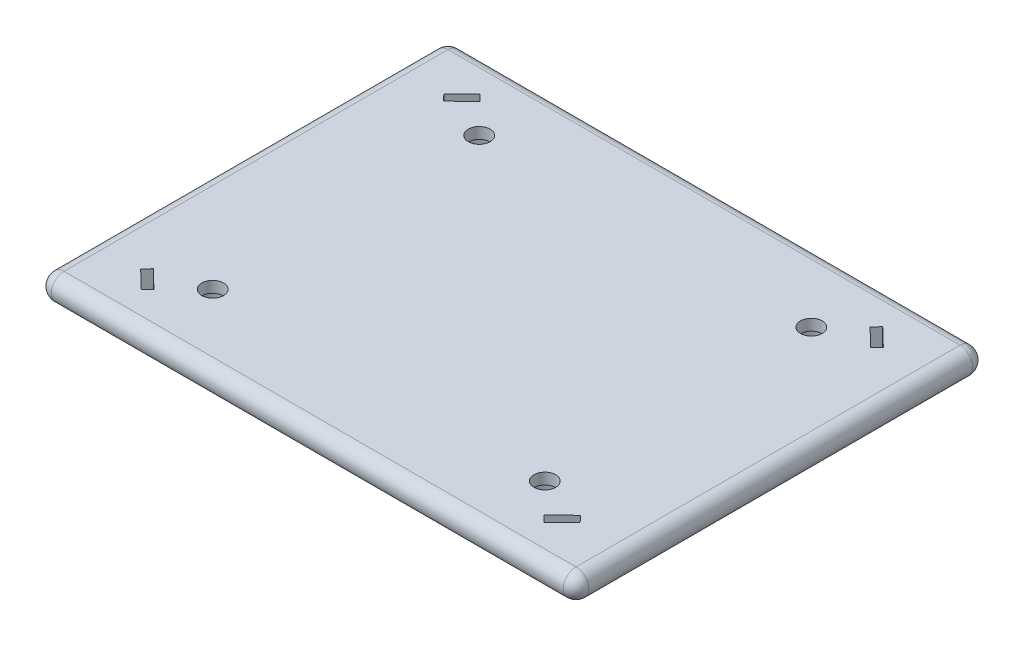
ISO-10303-21;
HEADER;
FILE_DESCRIPTION(('STEP AP214'),'2;1');
FILE_NAME('part.step','',(''),(''),'','','');
FILE_SCHEMA(('AUTOMOTIVE_DESIGN { 1 0 10303 214 1 1 1 1 }'));
ENDSEC;
DATA;
#1=APPLICATION_CONTEXT('core data for automotive mechanical design processes');
#2=APPLICATION_PROTOCOL_DEFINITION('international standard','automotive_design',2000,#1);
#3=PRODUCT_CONTEXT('',#1,'mechanical');
#4=PRODUCT('Part','Part','',(#3));
#5=PRODUCT_RELATED_PRODUCT_CATEGORY('part','',(#4));
#6=PRODUCT_DEFINITION_FORMATION('','',#4);
#7=PRODUCT_DEFINITION_CONTEXT('part definition',#1,'design');
#8=PRODUCT_DEFINITION('design','',#6,#7);
#9=PRODUCT_DEFINITION_SHAPE('','',#8);
#10=(LENGTH_UNIT() NAMED_UNIT(*) SI_UNIT(.MILLI.,.METRE.));
#11=(NAMED_UNIT(*) PLANE_ANGLE_UNIT() SI_UNIT($,.RADIAN.));
#12=(NAMED_UNIT(*) SI_UNIT($,.STERADIAN.) SOLID_ANGLE_UNIT());
#13=UNCERTAINTY_MEASURE_WITH_UNIT(LENGTH_MEASURE(1.E-05),#10,'distance_accuracy_value','');
#14=(GEOMETRIC_REPRESENTATION_CONTEXT(3) GLOBAL_UNCERTAINTY_ASSIGNED_CONTEXT((#13)) GLOBAL_UNIT_ASSIGNED_CONTEXT((#10,
#11,#12)) REPRESENTATION_CONTEXT('',''));
#15=CARTESIAN_POINT('',(0.,0.,0.));
#16=DIRECTION('',(0.,0.,1.));
#17=DIRECTION('',(1.,0.,0.));
#18=AXIS2_PLACEMENT_3D('',#15,#16,#17);
#19=CARTESIAN_POINT('',(200.,10.,150.));
#20=DIRECTION('',(0.,0.,1.));
#21=DIRECTION('',(1.,0.,0.));
#22=AXIS2_PLACEMENT_3D('',#19,#20,#21);
#23=SPHERICAL_SURFACE('',#22,10.);
#24=CARTESIAN_POINT('',(200.,10.,150.));
#25=DIRECTION('',(0.,0.,-1.));
#26=DIRECTION('',(0.,1.,0.));
#27=AXIS2_PLACEMENT_3D('',#24,#25,#26);
#28=CIRCLE('',#27,10.);
#29=CARTESIAN_POINT('',(200.,20.,150.));
#30=VERTEX_POINT('',#29);
#31=CARTESIAN_POINT('',(200.,0.,150.));
#32=VERTEX_POINT('',#31);
#33=EDGE_CURVE('E11',#30,#32,#28,.T.);
#34=ORIENTED_EDGE('',*,*,#33,.F.);
#35=CARTESIAN_POINT('',(200.,10.,150.));
#36=DIRECTION('',(1.,0.,0.));
#37=DIRECTION('',(0.,0.,-1.));
#38=AXIS2_PLACEMENT_3D('',#35,#36,#37);
#39=CIRCLE('',#38,10.);
#40=EDGE_CURVE('E47',#30,#32,#39,.T.);
#41=ORIENTED_EDGE('',*,*,#40,.T.);
#42=EDGE_LOOP('',(#34,#41));
#43=FACE_BOUND('',#42,.T.);
#44=ADVANCED_FACE('F39',(#43),#23,.T.);
#45=CARTESIAN_POINT('',(-200.,10.,150.));
#46=DIRECTION('',(1.,0.,0.));
#47=DIRECTION('',(0.,0.,-1.));
#48=AXIS2_PLACEMENT_3D('',#45,#46,#47);
#49=CYLINDRICAL_SURFACE('',#48,10.);
#50=ORIENTED_EDGE('',*,*,#40,.F.);
#51=DIRECTION('',(1.,0.,0.));
#52=VECTOR('',#51,1.);
#53=CARTESIAN_POINT('',(200.,20.,150.));
#54=LINE('',#53,#52);
#55=CARTESIAN_POINT('',(-200.,20.,150.));
#56=VERTEX_POINT('',#55);
#57=EDGE_CURVE('E314',#56,#30,#54,.T.);
#58=ORIENTED_EDGE('',*,*,#57,.F.);
#59=CARTESIAN_POINT('',(-200.,10.,150.));
#60=DIRECTION('',(1.,0.,0.));
#61=DIRECTION('',(0.,0.,-1.));
#62=AXIS2_PLACEMENT_3D('',#59,#60,#61);
#63=CIRCLE('',#62,10.);
#64=CARTESIAN_POINT('',(-200.,0.,150.));
#65=VERTEX_POINT('',#64);
#66=EDGE_CURVE('E347',#56,#65,#63,.T.);
#67=ORIENTED_EDGE('',*,*,#66,.T.);
#68=DIRECTION('',(-1.,0.,0.));
#69=VECTOR('',#68,1.);
#70=CARTESIAN_POINT('',(-200.,0.,150.));
#71=LINE('',#70,#69);
#72=EDGE_CURVE('E326',#32,#65,#71,.T.);
#73=ORIENTED_EDGE('',*,*,#72,.F.);
#74=EDGE_LOOP('',(#50,#58,#67,#73));
#75=FACE_BOUND('',#74,.T.);
#76=ADVANCED_FACE('F361',(#75),#49,.T.);
#77=CARTESIAN_POINT('',(-200.,10.,150.));
#78=DIRECTION('',(0.,0.,1.));
#79=DIRECTION('',(1.,0.,0.));
#80=AXIS2_PLACEMENT_3D('',#77,#78,#79);
#81=SPHERICAL_SURFACE('',#80,10.);
#82=ORIENTED_EDGE('',*,*,#66,.F.);
#83=CARTESIAN_POINT('',(-200.,10.,150.));
#84=DIRECTION('',(0.,0.,1.));
#85=DIRECTION('',(0.,-1.,0.));
#86=AXIS2_PLACEMENT_3D('',#83,#84,#85);
#87=CIRCLE('',#86,10.);
#88=EDGE_CURVE('E344',#56,#65,#87,.T.);
#89=ORIENTED_EDGE('',*,*,#88,.T.);
#90=EDGE_LOOP('',(#82,#89));
#91=FACE_BOUND('',#90,.T.);
#92=ADVANCED_FACE('F364',(#91),#81,.T.);
#93=CARTESIAN_POINT('',(-200.,10.,-150.));
#94=DIRECTION('',(0.,0.,1.));
#95=DIRECTION('',(1.,0.,0.));
#96=AXIS2_PLACEMENT_3D('',#93,#94,#95);
#97=CYLINDRICAL_SURFACE('',#96,10.);
#98=ORIENTED_EDGE('',*,*,#88,.F.);
#99=DIRECTION('',(0.,0.,1.));
#100=VECTOR('',#99,1.);
#101=CARTESIAN_POINT('',(-200.,20.,150.));
#102=LINE('',#101,#100);
#103=CARTESIAN_POINT('',(-200.,20.,-150.));
#104=VERTEX_POINT('',#103);
#105=EDGE_CURVE('E317',#104,#56,#102,.T.);
#106=ORIENTED_EDGE('',*,*,#105,.F.);
#107=CARTESIAN_POINT('',(-200.,10.,-150.));
#108=DIRECTION('',(0.,0.,1.));
#109=DIRECTION('',(1.,0.,0.));
#110=AXIS2_PLACEMENT_3D('',#107,#108,#109);
#111=CIRCLE('',#110,10.);
#112=CARTESIAN_POINT('',(-200.,0.,-150.));
#113=VERTEX_POINT('',#112);
#114=EDGE_CURVE('E62',#104,#113,#111,.T.);
#115=ORIENTED_EDGE('',*,*,#114,.T.);
#116=DIRECTION('',(0.,0.,-1.));
#117=VECTOR('',#116,1.);
#118=CARTESIAN_POINT('',(-200.,0.,-150.));
#119=LINE('',#118,#117);
#120=EDGE_CURVE('E329',#65,#113,#119,.T.);
#121=ORIENTED_EDGE('',*,*,#120,.F.);
#122=EDGE_LOOP('',(#98,#106,#115,#121));
#123=FACE_BOUND('',#122,.T.);
#124=ADVANCED_FACE('F365',(#123),#97,.T.);
#125=CARTESIAN_POINT('',(-200.,10.,-150.));
#126=DIRECTION('',(0.,0.,1.));
#127=DIRECTION('',(1.,0.,0.));
#128=AXIS2_PLACEMENT_3D('',#125,#126,#127);
#129=SPHERICAL_SURFACE('',#128,10.);
#130=ORIENTED_EDGE('',*,*,#114,.F.);
#131=CARTESIAN_POINT('',(-200.,10.,-150.));
#132=DIRECTION('',(-1.,0.,0.));
#133=DIRECTION('',(0.,-1.,0.));
#134=AXIS2_PLACEMENT_3D('',#131,#132,#133);
#135=CIRCLE('',#134,10.);
#136=EDGE_CURVE('E341',#104,#113,#135,.T.);
#137=ORIENTED_EDGE('',*,*,#136,.T.);
#138=EDGE_LOOP('',(#130,#137));
#139=FACE_BOUND('',#138,.T.);
#140=ADVANCED_FACE('F367',(#139),#129,.T.);
#141=CARTESIAN_POINT('',(200.,10.,-150.));
#142=DIRECTION('',(-1.,0.,0.));
#143=DIRECTION('',(0.,0.,1.));
#144=AXIS2_PLACEMENT_3D('',#141,#142,#143);
#145=CYLINDRICAL_SURFACE('',#144,10.);
#146=ORIENTED_EDGE('',*,*,#136,.F.);
#147=DIRECTION('',(-1.,0.,0.));
#148=VECTOR('',#147,1.);
#149=CARTESIAN_POINT('',(200.,20.,-150.));
#150=LINE('',#149,#148);
#151=CARTESIAN_POINT('',(200.,20.,-150.));
#152=VERTEX_POINT('',#151);
#153=EDGE_CURVE('E320',#152,#104,#150,.T.);
#154=ORIENTED_EDGE('',*,*,#153,.F.);
#155=CARTESIAN_POINT('',(200.,10.,-150.));
#156=DIRECTION('',(-1.,0.,0.));
#157=DIRECTION('',(0.,-1.,0.));
#158=AXIS2_PLACEMENT_3D('',#155,#156,#157);
#159=CIRCLE('',#158,10.);
#160=CARTESIAN_POINT('',(200.,0.,-150.));
#161=VERTEX_POINT('',#160);
#162=EDGE_CURVE('E54',#152,#161,#159,.T.);
#163=ORIENTED_EDGE('',*,*,#162,.T.);
#164=DIRECTION('',(1.,0.,0.));
#165=VECTOR('',#164,1.);
#166=CARTESIAN_POINT('',(200.,0.,-150.));
#167=LINE('',#166,#165);
#168=EDGE_CURVE('E332',#113,#161,#167,.T.);
#169=ORIENTED_EDGE('',*,*,#168,.F.);
#170=EDGE_LOOP('',(#146,#154,#163,#169));
#171=FACE_BOUND('',#170,.T.);
#172=ADVANCED_FACE('F373',(#171),#145,.T.);
#173=CARTESIAN_POINT('',(200.,10.,-150.));
#174=DIRECTION('',(0.,0.,1.));
#175=DIRECTION('',(1.,0.,0.));
#176=AXIS2_PLACEMENT_3D('',#173,#174,#175);
#177=SPHERICAL_SURFACE('',#176,10.);
#178=ORIENTED_EDGE('',*,*,#162,.F.);
#179=CARTESIAN_POINT('',(200.,10.,-150.));
#180=DIRECTION('',(0.,0.,-1.));
#181=DIRECTION('',(0.,1.,0.));
#182=AXIS2_PLACEMENT_3D('',#179,#180,#181);
#183=CIRCLE('',#182,10.);
#184=EDGE_CURVE('E338',#152,#161,#183,.T.);
#185=ORIENTED_EDGE('',*,*,#184,.T.);
#186=EDGE_LOOP('',(#178,#185));
#187=FACE_BOUND('',#186,.T.);
#188=ADVANCED_FACE('F402',(#187),#177,.T.);
#189=CARTESIAN_POINT('',(200.,10.,150.));
#190=DIRECTION('',(0.,0.,-1.));
#191=DIRECTION('',(-1.,0.,0.));
#192=AXIS2_PLACEMENT_3D('',#189,#190,#191);
#193=CYLINDRICAL_SURFACE('',#192,10.);
#194=DIRECTION('',(0.,0.,-1.));
#195=VECTOR('',#194,1.);
#196=CARTESIAN_POINT('',(200.,20.,150.));
#197=LINE('',#196,#195);
#198=EDGE_CURVE('E323',#30,#152,#197,.T.);
#199=ORIENTED_EDGE('',*,*,#198,.F.);
#200=ORIENTED_EDGE('',*,*,#33,.T.);
#201=DIRECTION('',(0.,0.,1.));
#202=VECTOR('',#201,1.);
#203=CARTESIAN_POINT('',(200.,0.,150.));
#204=LINE('',#203,#202);
#205=EDGE_CURVE('E335',#161,#32,#204,.T.);
#206=ORIENTED_EDGE('',*,*,#205,.F.);
#207=ORIENTED_EDGE('',*,*,#184,.F.);
#208=EDGE_LOOP('',(#199,#200,#206,#207));
#209=FACE_BOUND('',#208,.T.);
#210=ADVANCED_FACE('F406',(#209),#193,.T.);
#211=CARTESIAN_POINT('',(200.,20.,150.));
#212=DIRECTION('',(0.,-1.,0.));
#213=DIRECTION('',(0.,0.,-1.));
#214=AXIS2_PLACEMENT_3D('',#211,#212,#213);
#215=PLANE('',#214);
#216=ORIENTED_EDGE('',*,*,#57,.T.);
#217=ORIENTED_EDGE('',*,*,#198,.T.);
#218=ORIENTED_EDGE('',*,*,#153,.T.);
#219=ORIENTED_EDGE('',*,*,#105,.T.);
#220=EDGE_LOOP('',(#216,#217,#218,#219));
#221=FACE_BOUND('',#220,.T.);
#222=CARTESIAN_POINT('',(129.745275192974,20.,104.108127054843));
#223=DIRECTION('',(0.,-1.,0.));
#224=DIRECTION('',(0.,0.,-1.));
#225=AXIS2_PLACEMENT_3D('',#222,#223,#224);
#226=CIRCLE('',#225,8.53313);
#227=CARTESIAN_POINT('',(129.745275192974,20.,95.5749970548432));
#228=VERTEX_POINT('',#227);
#229=EDGE_CURVE('E554',#228,#228,#226,.T.);
#230=ORIENTED_EDGE('',*,*,#229,.T.);
#231=EDGE_LOOP('',(#230));
#232=FACE_BOUND('',#231,.T.);
#233=CARTESIAN_POINT('',(-129.745275192974,20.,-104.108127054843));
#234=DIRECTION('',(0.,-1.,0.));
#235=DIRECTION('',(0.,0.,-1.));
#236=AXIS2_PLACEMENT_3D('',#233,#234,#235);
#237=CIRCLE('',#236,8.53313);
#238=CARTESIAN_POINT('',(-129.745275192974,20.,-112.641257054843));
#239=VERTEX_POINT('',#238);
#240=EDGE_CURVE('E569',#239,#239,#237,.T.);
#241=ORIENTED_EDGE('',*,*,#240,.T.);
#242=EDGE_LOOP('',(#241));
#243=FACE_BOUND('',#242,.T.);
#244=CARTESIAN_POINT('',(129.745275192974,20.,-104.108127054843));
#245=DIRECTION('',(0.,-1.,0.));
#246=DIRECTION('',(0.,0.,-1.));
#247=AXIS2_PLACEMENT_3D('',#244,#245,#246);
#248=CIRCLE('',#247,8.53313);
#249=CARTESIAN_POINT('',(129.745275192974,20.,-112.641257054843));
#250=VERTEX_POINT('',#249);
#251=EDGE_CURVE('E584',#250,#250,#248,.T.);
#252=ORIENTED_EDGE('',*,*,#251,.T.);
#253=EDGE_LOOP('',(#252));
#254=FACE_BOUND('',#253,.T.);
#255=CARTESIAN_POINT('',(-129.745275192974,20.,104.108127054843));
#256=DIRECTION('',(0.,-1.,0.));
#257=DIRECTION('',(0.,0.,-1.));
#258=AXIS2_PLACEMENT_3D('',#255,#256,#257);
#259=CIRCLE('',#258,8.53313);
#260=CARTESIAN_POINT('',(-129.745275192974,20.,95.5749970548432));
#261=VERTEX_POINT('',#260);
#262=EDGE_CURVE('E211',#261,#261,#259,.T.);
#263=ORIENTED_EDGE('',*,*,#262,.T.);
#264=EDGE_LOOP('',(#263));
#265=FACE_BOUND('',#264,.T.);
#266=DIRECTION('',(0.694645926840476,0.,0.719351816793379));
#267=VECTOR('',#266,1.);
#268=CARTESIAN_POINT('',(157.328690372666,20.,132.321363832697));
#269=LINE('',#268,#267);
#270=CARTESIAN_POINT('',(152.466168884783,20.,127.285901115144));
#271=VERTEX_POINT('',#270);
#272=CARTESIAN_POINT('',(157.328690372666,20.,132.321363832697));
#273=VERTEX_POINT('',#272);
#274=EDGE_CURVE('E222',#271,#273,#269,.T.);
#275=ORIENTED_EDGE('',*,*,#274,.F.);
#276=DIRECTION('',(-0.719351816793377,0.,0.694645926840479));
#277=VECTOR('',#276,1.);
#278=CARTESIAN_POINT('',(152.466168884783,20.,127.285901115144));
#279=LINE('',#278,#277);
#280=CARTESIAN_POINT('',(166.853205220651,20.,113.392982578334));
#281=VERTEX_POINT('',#280);
#282=EDGE_CURVE('E230',#281,#271,#279,.T.);
#283=ORIENTED_EDGE('',*,*,#282,.F.);
#284=DIRECTION('',(-0.694645926840476,0.,-0.719351816793379));
#285=VECTOR('',#284,1.);
#286=CARTESIAN_POINT('',(171.715726708534,20.,118.428445295888));
#287=LINE('',#286,#285);
#288=CARTESIAN_POINT('',(171.715726708534,20.,118.428445295888));
#289=VERTEX_POINT('',#288);
#290=EDGE_CURVE('E227',#289,#281,#287,.T.);
#291=ORIENTED_EDGE('',*,*,#290,.F.);
#292=DIRECTION('',(0.719351816793379,0.,-0.694645926840477));
#293=VECTOR('',#292,1.);
#294=CARTESIAN_POINT('',(157.328690372666,20.,132.321363832697));
#295=LINE('',#294,#293);
#296=EDGE_CURVE('E224',#273,#289,#295,.T.);
#297=ORIENTED_EDGE('',*,*,#296,.F.);
#298=EDGE_LOOP('',(#275,#283,#291,#297));
#299=FACE_BOUND('',#298,.T.);
#300=DIRECTION('',(0.719351816793379,0.,0.694645926840477));
#301=VECTOR('',#300,1.);
#302=CARTESIAN_POINT('',(-157.328690372666,20.,132.321363832697));
#303=LINE('',#302,#301);
#304=CARTESIAN_POINT('',(-171.715726708534,20.,118.428445295888));
#305=VERTEX_POINT('',#304);
#306=CARTESIAN_POINT('',(-157.328690372666,20.,132.321363832697));
#307=VERTEX_POINT('',#306);
#308=EDGE_CURVE('E284',#305,#307,#303,.T.);
#309=ORIENTED_EDGE('',*,*,#308,.F.);
#310=DIRECTION('',(-0.694645926840476,0.,0.719351816793379));
#311=VECTOR('',#310,1.);
#312=CARTESIAN_POINT('',(-171.715726708534,20.,118.428445295888));
#313=LINE('',#312,#311);
#314=CARTESIAN_POINT('',(-166.853205220651,20.,113.392982578334));
#315=VERTEX_POINT('',#314);
#316=EDGE_CURVE('E292',#315,#305,#313,.T.);
#317=ORIENTED_EDGE('',*,*,#316,.F.);
#318=DIRECTION('',(-0.719351816793377,0.,-0.694645926840479));
#319=VECTOR('',#318,1.);
#320=CARTESIAN_POINT('',(-152.466168884783,20.,127.285901115144));
#321=LINE('',#320,#319);
#322=CARTESIAN_POINT('',(-152.466168884783,20.,127.285901115144));
#323=VERTEX_POINT('',#322);
#324=EDGE_CURVE('E289',#323,#315,#321,.T.);
#325=ORIENTED_EDGE('',*,*,#324,.F.);
#326=DIRECTION('',(0.694645926840476,0.,-0.719351816793379));
#327=VECTOR('',#326,1.);
#328=CARTESIAN_POINT('',(-157.328690372666,20.,132.321363832697));
#329=LINE('',#328,#327);
#330=EDGE_CURVE('E286',#307,#323,#329,.T.);
#331=ORIENTED_EDGE('',*,*,#330,.F.);
#332=EDGE_LOOP('',(#309,#317,#325,#331));
#333=FACE_BOUND('',#332,.T.);
#334=DIRECTION('',(-0.694645926840476,0.,-0.719351816793379));
#335=VECTOR('',#334,1.);
#336=CARTESIAN_POINT('',(-157.328690372666,20.,-132.321363832697));
#337=LINE('',#336,#335);
#338=CARTESIAN_POINT('',(-152.466168884783,20.,-127.285901115144));
#339=VERTEX_POINT('',#338);
#340=CARTESIAN_POINT('',(-157.328690372666,20.,-132.321363832697));
#341=VERTEX_POINT('',#340);
#342=EDGE_CURVE('E253',#339,#341,#337,.T.);
#343=ORIENTED_EDGE('',*,*,#342,.F.);
#344=DIRECTION('',(0.71935181679338,0.,-0.694645926840476));
#345=VECTOR('',#344,1.);
#346=CARTESIAN_POINT('',(-152.466168884783,20.,-127.285901115144));
#347=LINE('',#346,#345);
#348=CARTESIAN_POINT('',(-166.853205220651,20.,-113.392982578334));
#349=VERTEX_POINT('',#348);
#350=EDGE_CURVE('E261',#349,#339,#347,.T.);
#351=ORIENTED_EDGE('',*,*,#350,.F.);
#352=DIRECTION('',(0.694645926840475,0.,0.71935181679338));
#353=VECTOR('',#352,1.);
#354=CARTESIAN_POINT('',(-171.715726708534,20.,-118.428445295888));
#355=LINE('',#354,#353);
#356=CARTESIAN_POINT('',(-171.715726708534,20.,-118.428445295888));
#357=VERTEX_POINT('',#356);
#358=EDGE_CURVE('E258',#357,#349,#355,.T.);
#359=ORIENTED_EDGE('',*,*,#358,.F.);
#360=DIRECTION('',(-0.719351816793379,0.,0.694645926840477));
#361=VECTOR('',#360,1.);
#362=CARTESIAN_POINT('',(-157.328690372666,20.,-132.321363832697));
#363=LINE('',#362,#361);
#364=EDGE_CURVE('E255',#341,#357,#363,.T.);
#365=ORIENTED_EDGE('',*,*,#364,.F.);
#366=EDGE_LOOP('',(#343,#351,#359,#365));
#367=FACE_BOUND('',#366,.T.);
#368=DIRECTION('',(-0.719351816793379,0.,-0.694645926840477));
#369=VECTOR('',#368,1.);
#370=CARTESIAN_POINT('',(157.328690372666,20.,-132.321363832697));
#371=LINE('',#370,#369);
#372=CARTESIAN_POINT('',(171.715726708534,20.,-118.428445295888));
#373=VERTEX_POINT('',#372);
#374=CARTESIAN_POINT('',(157.328690372666,20.,-132.321363832697));
#375=VERTEX_POINT('',#374);
#376=EDGE_CURVE('E178',#373,#375,#371,.T.);
#377=ORIENTED_EDGE('',*,*,#376,.F.);
#378=DIRECTION('',(0.694645926840476,0.,-0.719351816793379));
#379=VECTOR('',#378,1.);
#380=CARTESIAN_POINT('',(171.715726708534,20.,-118.428445295888));
#381=LINE('',#380,#379);
#382=CARTESIAN_POINT('',(166.853205220651,20.,-113.392982578334));
#383=VERTEX_POINT('',#382);
#384=EDGE_CURVE('E204',#383,#373,#381,.T.);
#385=ORIENTED_EDGE('',*,*,#384,.F.);
#386=DIRECTION('',(0.719351816793377,0.,0.694645926840479));
#387=VECTOR('',#386,1.);
#388=CARTESIAN_POINT('',(152.466168884783,20.,-127.285901115144));
#389=LINE('',#388,#387);
#390=CARTESIAN_POINT('',(152.466168884783,20.,-127.285901115144));
#391=VERTEX_POINT('',#390);
#392=EDGE_CURVE('E202',#391,#383,#389,.T.);
#393=ORIENTED_EDGE('',*,*,#392,.F.);
#394=DIRECTION('',(-0.694645926840476,0.,0.719351816793379));
#395=VECTOR('',#394,1.);
#396=CARTESIAN_POINT('',(157.328690372666,20.,-132.321363832697));
#397=LINE('',#396,#395);
#398=EDGE_CURVE('E188',#375,#391,#397,.T.);
#399=ORIENTED_EDGE('',*,*,#398,.F.);
#400=EDGE_LOOP('',(#377,#385,#393,#399));
#401=FACE_BOUND('',#400,.T.);
#402=ADVANCED_FACE('F200',(#221,#232,#243,#254,#265,#299,#333,#367,#401),#215,.F.);
#403=CARTESIAN_POINT('',(200.,0.,150.));
#404=DIRECTION('',(0.,-1.,0.));
#405=DIRECTION('',(0.,0.,-1.));
#406=AXIS2_PLACEMENT_3D('',#403,#404,#405);
#407=PLANE('',#406);
#408=ORIENTED_EDGE('',*,*,#168,.T.);
#409=ORIENTED_EDGE('',*,*,#205,.T.);
#410=ORIENTED_EDGE('',*,*,#72,.T.);
#411=ORIENTED_EDGE('',*,*,#120,.T.);
#412=EDGE_LOOP('',(#408,#409,#410,#411));
#413=FACE_BOUND('',#412,.T.);
#414=CARTESIAN_POINT('',(129.745275192974,0.,104.108127054843));
#415=DIRECTION('',(0.,-1.,0.));
#416=DIRECTION('',(0.,0.,-1.));
#417=AXIS2_PLACEMENT_3D('',#414,#415,#416);
#418=CIRCLE('',#417,18.0975);
#419=CARTESIAN_POINT('',(129.745275192974,0.,86.0106270548432));
#420=VERTEX_POINT('',#419);
#421=EDGE_CURVE('E544',#420,#420,#418,.T.);
#422=ORIENTED_EDGE('',*,*,#421,.F.);
#423=EDGE_LOOP('',(#422));
#424=FACE_BOUND('',#423,.T.);
#425=CARTESIAN_POINT('',(-129.745275192974,0.,-104.108127054843));
#426=DIRECTION('',(0.,-1.,0.));
#427=DIRECTION('',(0.,0.,-1.));
#428=AXIS2_PLACEMENT_3D('',#425,#426,#427);
#429=CIRCLE('',#428,18.0975);
#430=CARTESIAN_POINT('',(-129.745275192974,0.,-122.205627054843));
#431=VERTEX_POINT('',#430);
#432=EDGE_CURVE('E557',#431,#431,#429,.T.);
#433=ORIENTED_EDGE('',*,*,#432,.F.);
#434=EDGE_LOOP('',(#433));
#435=FACE_BOUND('',#434,.T.);
#436=CARTESIAN_POINT('',(129.745275192974,0.,-104.108127054843));
#437=DIRECTION('',(0.,-1.,0.));
#438=DIRECTION('',(0.,0.,-1.));
#439=AXIS2_PLACEMENT_3D('',#436,#437,#438);
#440=CIRCLE('',#439,18.0975);
#441=CARTESIAN_POINT('',(129.745275192974,0.,-122.205627054843));
#442=VERTEX_POINT('',#441);
#443=EDGE_CURVE('E572',#442,#442,#440,.T.);
#444=ORIENTED_EDGE('',*,*,#443,.F.);
#445=EDGE_LOOP('',(#444));
#446=FACE_BOUND('',#445,.T.);
#447=CARTESIAN_POINT('',(-129.745275192974,0.,104.108127054843));
#448=DIRECTION('',(0.,-1.,0.));
#449=DIRECTION('',(0.,0.,-1.));
#450=AXIS2_PLACEMENT_3D('',#447,#448,#449);
#451=CIRCLE('',#450,18.0975);
#452=CARTESIAN_POINT('',(-129.745275192974,0.,86.0106270548432));
#453=VERTEX_POINT('',#452);
#454=EDGE_CURVE('E587',#453,#453,#451,.T.);
#455=ORIENTED_EDGE('',*,*,#454,.F.);
#456=EDGE_LOOP('',(#455));
#457=FACE_BOUND('',#456,.T.);
#458=DIRECTION('',(-0.694645926840476,0.,0.719351816793379));
#459=VECTOR('',#458,1.);
#460=CARTESIAN_POINT('',(-171.715726708534,0.,118.428445295888));
#461=LINE('',#460,#459);
#462=CARTESIAN_POINT('',(-166.853205220651,0.,113.392982578334));
#463=VERTEX_POINT('',#462);
#464=CARTESIAN_POINT('',(-171.715726708534,0.,118.428445295888));
#465=VERTEX_POINT('',#464);
#466=EDGE_CURVE('E287',#463,#465,#461,.T.);
#467=ORIENTED_EDGE('',*,*,#466,.T.);
#468=DIRECTION('',(0.719351816793379,0.,0.694645926840477));
#469=VECTOR('',#468,1.);
#470=CARTESIAN_POINT('',(-157.328690372666,0.,132.321363832697));
#471=LINE('',#470,#469);
#472=CARTESIAN_POINT('',(-157.328690372666,0.,132.321363832697));
#473=VERTEX_POINT('',#472);
#474=EDGE_CURVE('E283',#465,#473,#471,.T.);
#475=ORIENTED_EDGE('',*,*,#474,.T.);
#476=DIRECTION('',(0.694645926840476,0.,-0.719351816793379));
#477=VECTOR('',#476,1.);
#478=CARTESIAN_POINT('',(-157.328690372666,0.,132.321363832697));
#479=LINE('',#478,#477);
#480=CARTESIAN_POINT('',(-152.466168884783,0.,127.285901115144));
#481=VERTEX_POINT('',#480);
#482=EDGE_CURVE('E297',#473,#481,#479,.T.);
#483=ORIENTED_EDGE('',*,*,#482,.T.);
#484=DIRECTION('',(-0.719351816793377,0.,-0.694645926840479));
#485=VECTOR('',#484,1.);
#486=CARTESIAN_POINT('',(-152.466168884783,0.,127.285901115144));
#487=LINE('',#486,#485);
#488=EDGE_CURVE('E300',#481,#463,#487,.T.);
#489=ORIENTED_EDGE('',*,*,#488,.T.);
#490=EDGE_LOOP('',(#467,#475,#483,#489));
#491=FACE_BOUND('',#490,.T.);
#492=DIRECTION('',(0.71935181679338,0.,-0.694645926840476));
#493=VECTOR('',#492,1.);
#494=CARTESIAN_POINT('',(-152.466168884783,0.,-127.285901115144));
#495=LINE('',#494,#493);
#496=CARTESIAN_POINT('',(-166.853205220651,0.,-113.392982578334));
#497=VERTEX_POINT('',#496);
#498=CARTESIAN_POINT('',(-152.466168884783,0.,-127.285901115144));
#499=VERTEX_POINT('',#498);
#500=EDGE_CURVE('E256',#497,#499,#495,.T.);
#501=ORIENTED_EDGE('',*,*,#500,.T.);
#502=DIRECTION('',(-0.694645926840476,0.,-0.719351816793379));
#503=VECTOR('',#502,1.);
#504=CARTESIAN_POINT('',(-157.328690372666,0.,-132.321363832697));
#505=LINE('',#504,#503);
#506=CARTESIAN_POINT('',(-157.328690372666,0.,-132.321363832697));
#507=VERTEX_POINT('',#506);
#508=EDGE_CURVE('E252',#499,#507,#505,.T.);
#509=ORIENTED_EDGE('',*,*,#508,.T.);
#510=DIRECTION('',(-0.719351816793379,0.,0.694645926840477));
#511=VECTOR('',#510,1.);
#512=CARTESIAN_POINT('',(-157.328690372666,0.,-132.321363832697));
#513=LINE('',#512,#511);
#514=CARTESIAN_POINT('',(-171.715726708534,0.,-118.428445295888));
#515=VERTEX_POINT('',#514);
#516=EDGE_CURVE('E266',#507,#515,#513,.T.);
#517=ORIENTED_EDGE('',*,*,#516,.T.);
#518=DIRECTION('',(0.694645926840475,0.,0.71935181679338));
#519=VECTOR('',#518,1.);
#520=CARTESIAN_POINT('',(-171.715726708534,0.,-118.428445295888));
#521=LINE('',#520,#519);
#522=EDGE_CURVE('E269',#515,#497,#521,.T.);
#523=ORIENTED_EDGE('',*,*,#522,.T.);
#524=EDGE_LOOP('',(#501,#509,#517,#523));
#525=FACE_BOUND('',#524,.T.);
#526=DIRECTION('',(-0.719351816793377,0.,0.694645926840479));
#527=VECTOR('',#526,1.);
#528=CARTESIAN_POINT('',(152.466168884783,0.,127.285901115144));
#529=LINE('',#528,#527);
#530=CARTESIAN_POINT('',(166.853205220651,0.,113.392982578334));
#531=VERTEX_POINT('',#530);
#532=CARTESIAN_POINT('',(152.466168884783,0.,127.285901115144));
#533=VERTEX_POINT('',#532);
#534=EDGE_CURVE('E225',#531,#533,#529,.T.);
#535=ORIENTED_EDGE('',*,*,#534,.T.);
#536=DIRECTION('',(0.694645926840476,0.,0.719351816793379));
#537=VECTOR('',#536,1.);
#538=CARTESIAN_POINT('',(157.328690372666,0.,132.321363832697));
#539=LINE('',#538,#537);
#540=CARTESIAN_POINT('',(157.328690372666,0.,132.321363832697));
#541=VERTEX_POINT('',#540);
#542=EDGE_CURVE('E196',#533,#541,#539,.T.);
#543=ORIENTED_EDGE('',*,*,#542,.T.);
#544=DIRECTION('',(0.719351816793379,0.,-0.694645926840477));
#545=VECTOR('',#544,1.);
#546=CARTESIAN_POINT('',(157.328690372666,0.,132.321363832697));
#547=LINE('',#546,#545);
#548=CARTESIAN_POINT('',(171.715726708534,0.,118.428445295888));
#549=VERTEX_POINT('',#548);
#550=EDGE_CURVE('E235',#541,#549,#547,.T.);
#551=ORIENTED_EDGE('',*,*,#550,.T.);
#552=DIRECTION('',(-0.694645926840476,0.,-0.719351816793379));
#553=VECTOR('',#552,1.);
#554=CARTESIAN_POINT('',(171.715726708534,0.,118.428445295888));
#555=LINE('',#554,#553);
#556=EDGE_CURVE('E238',#549,#531,#555,.T.);
#557=ORIENTED_EDGE('',*,*,#556,.T.);
#558=EDGE_LOOP('',(#535,#543,#551,#557));
#559=FACE_BOUND('',#558,.T.);
#560=DIRECTION('',(0.694645926840476,0.,-0.719351816793379));
#561=VECTOR('',#560,1.);
#562=CARTESIAN_POINT('',(171.715726708534,0.,-118.428445295888));
#563=LINE('',#562,#561);
#564=CARTESIAN_POINT('',(166.853205220651,0.,-113.392982578334));
#565=VERTEX_POINT('',#564);
#566=CARTESIAN_POINT('',(171.715726708534,0.,-118.428445295888));
#567=VERTEX_POINT('',#566);
#568=EDGE_CURVE('E189',#565,#567,#563,.T.);
#569=ORIENTED_EDGE('',*,*,#568,.T.);
#570=DIRECTION('',(-0.719351816793379,0.,-0.694645926840477));
#571=VECTOR('',#570,1.);
#572=CARTESIAN_POINT('',(157.328690372666,0.,-132.321363832697));
#573=LINE('',#572,#571);
#574=CARTESIAN_POINT('',(157.328690372666,0.,-132.321363832697));
#575=VERTEX_POINT('',#574);
#576=EDGE_CURVE('E209',#567,#575,#573,.T.);
#577=ORIENTED_EDGE('',*,*,#576,.T.);
#578=DIRECTION('',(-0.694645926840476,0.,0.719351816793379));
#579=VECTOR('',#578,1.);
#580=CARTESIAN_POINT('',(157.328690372666,0.,-132.321363832697));
#581=LINE('',#580,#579);
#582=CARTESIAN_POINT('',(152.466168884783,0.,-127.285901115144));
#583=VERTEX_POINT('',#582);
#584=EDGE_CURVE('E195',#575,#583,#581,.T.);
#585=ORIENTED_EDGE('',*,*,#584,.T.);
#586=DIRECTION('',(0.719351816793377,0.,0.694645926840479));
#587=VECTOR('',#586,1.);
#588=CARTESIAN_POINT('',(152.466168884783,0.,-127.285901115144));
#589=LINE('',#588,#587);
#590=EDGE_CURVE('E213',#583,#565,#589,.T.);
#591=ORIENTED_EDGE('',*,*,#590,.T.);
#592=EDGE_LOOP('',(#569,#577,#585,#591));
#593=FACE_BOUND('',#592,.T.);
#594=ADVANCED_FACE('F357',(#413,#424,#435,#446,#457,#491,#525,#559,#593),#407,.T.);
#595=CARTESIAN_POINT('',(-157.328690372666,20.,132.321363832697));
#596=DIRECTION('',(0.694645926840477,0.,-0.719351816793379));
#597=DIRECTION('',(-0.719351816793379,0.,-0.694645926840477));
#598=AXIS2_PLACEMENT_3D('',#595,#596,#597);
#599=PLANE('',#598);
#600=ORIENTED_EDGE('',*,*,#474,.F.);
#601=DIRECTION('',(0.,-1.,0.));
#602=VECTOR('',#601,1.);
#603=CARTESIAN_POINT('',(-171.715726708534,20.,118.428445295888));
#604=LINE('',#603,#602);
#605=EDGE_CURVE('E294',#305,#465,#604,.T.);
#606=ORIENTED_EDGE('',*,*,#605,.F.);
#607=ORIENTED_EDGE('',*,*,#308,.T.);
#608=DIRECTION('',(0.,-1.,0.));
#609=VECTOR('',#608,1.);
#610=CARTESIAN_POINT('',(-157.328690372666,20.,132.321363832697));
#611=LINE('',#610,#609);
#612=EDGE_CURVE('E311',#307,#473,#611,.T.);
#613=ORIENTED_EDGE('',*,*,#612,.T.);
#614=EDGE_LOOP('',(#600,#606,#607,#613));
#615=FACE_BOUND('',#614,.T.);
#616=ADVANCED_FACE('F411',(#615),#599,.T.);
#617=CARTESIAN_POINT('',(-157.328690372666,20.,132.321363832697));
#618=DIRECTION('',(-0.719351816793379,0.,-0.694645926840476));
#619=DIRECTION('',(-0.694645926840476,0.,0.719351816793379));
#620=AXIS2_PLACEMENT_3D('',#617,#618,#619);
#621=PLANE('',#620);
#622=ORIENTED_EDGE('',*,*,#482,.F.);
#623=ORIENTED_EDGE('',*,*,#612,.F.);
#624=ORIENTED_EDGE('',*,*,#330,.T.);
#625=DIRECTION('',(0.,-1.,0.));
#626=VECTOR('',#625,1.);
#627=CARTESIAN_POINT('',(-152.466168884783,20.,127.285901115144));
#628=LINE('',#627,#626);
#629=EDGE_CURVE('E309',#323,#481,#628,.T.);
#630=ORIENTED_EDGE('',*,*,#629,.T.);
#631=EDGE_LOOP('',(#622,#623,#624,#630));
#632=FACE_BOUND('',#631,.T.);
#633=ADVANCED_FACE('F417',(#632),#621,.T.);
#634=CARTESIAN_POINT('',(-152.466168884783,20.,127.285901115144));
#635=DIRECTION('',(-0.694645926840478,0.,0.719351816793377));
#636=DIRECTION('',(0.719351816793377,0.,0.694645926840478));
#637=AXIS2_PLACEMENT_3D('',#634,#635,#636);
#638=PLANE('',#637);
#639=ORIENTED_EDGE('',*,*,#488,.F.);
#640=ORIENTED_EDGE('',*,*,#629,.F.);
#641=ORIENTED_EDGE('',*,*,#324,.T.);
#642=DIRECTION('',(0.,-1.,0.));
#643=VECTOR('',#642,1.);
#644=CARTESIAN_POINT('',(-166.853205220651,20.,113.392982578334));
#645=LINE('',#644,#643);
#646=EDGE_CURVE('E307',#315,#463,#645,.T.);
#647=ORIENTED_EDGE('',*,*,#646,.T.);
#648=EDGE_LOOP('',(#639,#640,#641,#647));
#649=FACE_BOUND('',#648,.T.);
#650=ADVANCED_FACE('F421',(#649),#638,.T.);
#651=CARTESIAN_POINT('',(-171.715726708534,20.,118.428445295888));
#652=DIRECTION('',(0.719351816793379,0.,0.694645926840476));
#653=DIRECTION('',(0.694645926840476,0.,-0.719351816793379));
#654=AXIS2_PLACEMENT_3D('',#651,#652,#653);
#655=PLANE('',#654);
#656=ORIENTED_EDGE('',*,*,#466,.F.);
#657=ORIENTED_EDGE('',*,*,#646,.F.);
#658=ORIENTED_EDGE('',*,*,#316,.T.);
#659=ORIENTED_EDGE('',*,*,#605,.T.);
#660=EDGE_LOOP('',(#656,#657,#658,#659));
#661=FACE_BOUND('',#660,.T.);
#662=ADVANCED_FACE('F425',(#661),#655,.T.);
#663=CARTESIAN_POINT('',(-157.328690372666,20.,-132.321363832697));
#664=DIRECTION('',(-0.719351816793379,0.,0.694645926840476));
#665=DIRECTION('',(0.694645926840476,0.,0.719351816793379));
#666=AXIS2_PLACEMENT_3D('',#663,#664,#665);
#667=PLANE('',#666);
#668=ORIENTED_EDGE('',*,*,#508,.F.);
#669=DIRECTION('',(0.,-1.,0.));
#670=VECTOR('',#669,1.);
#671=CARTESIAN_POINT('',(-152.466168884783,20.,-127.285901115144));
#672=LINE('',#671,#670);
#673=EDGE_CURVE('E263',#339,#499,#672,.T.);
#674=ORIENTED_EDGE('',*,*,#673,.F.);
#675=ORIENTED_EDGE('',*,*,#342,.T.);
#676=DIRECTION('',(0.,-1.,0.));
#677=VECTOR('',#676,1.);
#678=CARTESIAN_POINT('',(-157.328690372666,20.,-132.321363832697));
#679=LINE('',#678,#677);
#680=EDGE_CURVE('E280',#341,#507,#679,.T.);
#681=ORIENTED_EDGE('',*,*,#680,.T.);
#682=EDGE_LOOP('',(#668,#674,#675,#681));
#683=FACE_BOUND('',#682,.T.);
#684=ADVANCED_FACE('F429',(#683),#667,.T.);
#685=CARTESIAN_POINT('',(-157.328690372666,20.,-132.321363832697));
#686=DIRECTION('',(0.694645926840477,0.,0.719351816793379));
#687=DIRECTION('',(0.719351816793379,0.,-0.694645926840477));
#688=AXIS2_PLACEMENT_3D('',#685,#686,#687);
#689=PLANE('',#688);
#690=ORIENTED_EDGE('',*,*,#516,.F.);
#691=ORIENTED_EDGE('',*,*,#680,.F.);
#692=ORIENTED_EDGE('',*,*,#364,.T.);
#693=DIRECTION('',(0.,-1.,0.));
#694=VECTOR('',#693,1.);
#695=CARTESIAN_POINT('',(-171.715726708534,20.,-118.428445295888));
#696=LINE('',#695,#694);
#697=EDGE_CURVE('E278',#357,#515,#696,.T.);
#698=ORIENTED_EDGE('',*,*,#697,.T.);
#699=EDGE_LOOP('',(#690,#691,#692,#698));
#700=FACE_BOUND('',#699,.T.);
#701=ADVANCED_FACE('F433',(#700),#689,.T.);
#702=CARTESIAN_POINT('',(-171.715726708534,20.,-118.428445295888));
#703=DIRECTION('',(0.71935181679338,0.,-0.694645926840475));
#704=DIRECTION('',(-0.694645926840475,0.,-0.71935181679338));
#705=AXIS2_PLACEMENT_3D('',#702,#703,#704);
#706=PLANE('',#705);
#707=ORIENTED_EDGE('',*,*,#522,.F.);
#708=ORIENTED_EDGE('',*,*,#697,.F.);
#709=ORIENTED_EDGE('',*,*,#358,.T.);
#710=DIRECTION('',(0.,-1.,0.));
#711=VECTOR('',#710,1.);
#712=CARTESIAN_POINT('',(-166.853205220651,20.,-113.392982578334));
#713=LINE('',#712,#711);
#714=EDGE_CURVE('E276',#349,#497,#713,.T.);
#715=ORIENTED_EDGE('',*,*,#714,.T.);
#716=EDGE_LOOP('',(#707,#708,#709,#715));
#717=FACE_BOUND('',#716,.T.);
#718=ADVANCED_FACE('F437',(#717),#706,.T.);
#719=CARTESIAN_POINT('',(-152.466168884783,20.,-127.285901115144));
#720=DIRECTION('',(-0.694645926840476,0.,-0.71935181679338));
#721=DIRECTION('',(-0.71935181679338,0.,0.694645926840476));
#722=AXIS2_PLACEMENT_3D('',#719,#720,#721);
#723=PLANE('',#722);
#724=ORIENTED_EDGE('',*,*,#500,.F.);
#725=ORIENTED_EDGE('',*,*,#714,.F.);
#726=ORIENTED_EDGE('',*,*,#350,.T.);
#727=ORIENTED_EDGE('',*,*,#673,.T.);
#728=EDGE_LOOP('',(#724,#725,#726,#727));
#729=FACE_BOUND('',#728,.T.);
#730=ADVANCED_FACE('F441',(#729),#723,.T.);
#731=CARTESIAN_POINT('',(157.328690372666,20.,132.321363832697));
#732=DIRECTION('',(0.719351816793379,0.,-0.694645926840476));
#733=DIRECTION('',(-0.694645926840476,0.,-0.719351816793379));
#734=AXIS2_PLACEMENT_3D('',#731,#732,#733);
#735=PLANE('',#734);
#736=ORIENTED_EDGE('',*,*,#542,.F.);
#737=DIRECTION('',(0.,-1.,0.));
#738=VECTOR('',#737,1.);
#739=CARTESIAN_POINT('',(152.466168884783,20.,127.285901115144));
#740=LINE('',#739,#738);
#741=EDGE_CURVE('E232',#271,#533,#740,.T.);
#742=ORIENTED_EDGE('',*,*,#741,.F.);
#743=ORIENTED_EDGE('',*,*,#274,.T.);
#744=DIRECTION('',(0.,-1.,0.));
#745=VECTOR('',#744,1.);
#746=CARTESIAN_POINT('',(157.328690372666,20.,132.321363832697));
#747=LINE('',#746,#745);
#748=EDGE_CURVE('E249',#273,#541,#747,.T.);
#749=ORIENTED_EDGE('',*,*,#748,.T.);
#750=EDGE_LOOP('',(#736,#742,#743,#749));
#751=FACE_BOUND('',#750,.T.);
#752=ADVANCED_FACE('F445',(#751),#735,.T.);
#753=CARTESIAN_POINT('',(157.328690372666,20.,132.321363832697));
#754=DIRECTION('',(-0.694645926840477,0.,-0.719351816793379));
#755=DIRECTION('',(-0.719351816793379,0.,0.694645926840477));
#756=AXIS2_PLACEMENT_3D('',#753,#754,#755);
#757=PLANE('',#756);
#758=ORIENTED_EDGE('',*,*,#550,.F.);
#759=ORIENTED_EDGE('',*,*,#748,.F.);
#760=ORIENTED_EDGE('',*,*,#296,.T.);
#761=DIRECTION('',(0.,-1.,0.));
#762=VECTOR('',#761,1.);
#763=CARTESIAN_POINT('',(171.715726708534,20.,118.428445295888));
#764=LINE('',#763,#762);
#765=EDGE_CURVE('E247',#289,#549,#764,.T.);
#766=ORIENTED_EDGE('',*,*,#765,.T.);
#767=EDGE_LOOP('',(#758,#759,#760,#766));
#768=FACE_BOUND('',#767,.T.);
#769=ADVANCED_FACE('F449',(#768),#757,.T.);
#770=CARTESIAN_POINT('',(171.715726708534,20.,118.428445295888));
#771=DIRECTION('',(-0.719351816793379,0.,0.694645926840476));
#772=DIRECTION('',(0.694645926840476,0.,0.719351816793379));
#773=AXIS2_PLACEMENT_3D('',#770,#771,#772);
#774=PLANE('',#773);
#775=ORIENTED_EDGE('',*,*,#556,.F.);
#776=ORIENTED_EDGE('',*,*,#765,.F.);
#777=ORIENTED_EDGE('',*,*,#290,.T.);
#778=DIRECTION('',(0.,-1.,0.));
#779=VECTOR('',#778,1.);
#780=CARTESIAN_POINT('',(166.853205220651,20.,113.392982578334));
#781=LINE('',#780,#779);
#782=EDGE_CURVE('E245',#281,#531,#781,.T.);
#783=ORIENTED_EDGE('',*,*,#782,.T.);
#784=EDGE_LOOP('',(#775,#776,#777,#783));
#785=FACE_BOUND('',#784,.T.);
#786=ADVANCED_FACE('F453',(#785),#774,.T.);
#787=CARTESIAN_POINT('',(152.466168884783,20.,127.285901115144));
#788=DIRECTION('',(0.694645926840478,0.,0.719351816793377));
#789=DIRECTION('',(0.719351816793377,0.,-0.694645926840478));
#790=AXIS2_PLACEMENT_3D('',#787,#788,#789);
#791=PLANE('',#790);
#792=ORIENTED_EDGE('',*,*,#534,.F.);
#793=ORIENTED_EDGE('',*,*,#782,.F.);
#794=ORIENTED_EDGE('',*,*,#282,.T.);
#795=ORIENTED_EDGE('',*,*,#741,.T.);
#796=EDGE_LOOP('',(#792,#793,#794,#795));
#797=FACE_BOUND('',#796,.T.);
#798=ADVANCED_FACE('F457',(#797),#791,.T.);
#799=CARTESIAN_POINT('',(157.328690372666,20.,-132.321363832697));
#800=DIRECTION('',(-0.694645926840477,0.,0.719351816793379));
#801=DIRECTION('',(0.719351816793379,0.,0.694645926840477));
#802=AXIS2_PLACEMENT_3D('',#799,#800,#801);
#803=PLANE('',#802);
#804=ORIENTED_EDGE('',*,*,#576,.F.);
#805=DIRECTION('',(0.,-1.,0.));
#806=VECTOR('',#805,1.);
#807=CARTESIAN_POINT('',(171.715726708534,20.,-118.428445295888));
#808=LINE('',#807,#806);
#809=EDGE_CURVE('E184',#373,#567,#808,.T.);
#810=ORIENTED_EDGE('',*,*,#809,.F.);
#811=ORIENTED_EDGE('',*,*,#376,.T.);
#812=DIRECTION('',(0.,-1.,0.));
#813=VECTOR('',#812,1.);
#814=CARTESIAN_POINT('',(157.328690372666,20.,-132.321363832697));
#815=LINE('',#814,#813);
#816=EDGE_CURVE('E181',#375,#575,#815,.T.);
#817=ORIENTED_EDGE('',*,*,#816,.T.);
#818=EDGE_LOOP('',(#804,#810,#811,#817));
#819=FACE_BOUND('',#818,.T.);
#820=ADVANCED_FACE('F180',(#819),#803,.T.);
#821=CARTESIAN_POINT('',(157.328690372666,20.,-132.321363832697));
#822=DIRECTION('',(0.719351816793379,0.,0.694645926840476));
#823=DIRECTION('',(0.694645926840476,0.,-0.719351816793379));
#824=AXIS2_PLACEMENT_3D('',#821,#822,#823);
#825=PLANE('',#824);
#826=ORIENTED_EDGE('',*,*,#584,.F.);
#827=ORIENTED_EDGE('',*,*,#816,.F.);
#828=ORIENTED_EDGE('',*,*,#398,.T.);
#829=DIRECTION('',(0.,-1.,0.));
#830=VECTOR('',#829,1.);
#831=CARTESIAN_POINT('',(152.466168884783,20.,-127.285901115144));
#832=LINE('',#831,#830);
#833=EDGE_CURVE('E197',#391,#583,#832,.T.);
#834=ORIENTED_EDGE('',*,*,#833,.T.);
#835=EDGE_LOOP('',(#826,#827,#828,#834));
#836=FACE_BOUND('',#835,.T.);
#837=ADVANCED_FACE('F192',(#836),#825,.T.);
#838=CARTESIAN_POINT('',(152.466168884783,20.,-127.285901115144));
#839=DIRECTION('',(0.694645926840478,0.,-0.719351816793377));
#840=DIRECTION('',(-0.719351816793377,0.,-0.694645926840478));
#841=AXIS2_PLACEMENT_3D('',#838,#839,#840);
#842=PLANE('',#841);
#843=ORIENTED_EDGE('',*,*,#590,.F.);
#844=ORIENTED_EDGE('',*,*,#833,.F.);
#845=ORIENTED_EDGE('',*,*,#392,.T.);
#846=DIRECTION('',(0.,-1.,0.));
#847=VECTOR('',#846,1.);
#848=CARTESIAN_POINT('',(166.853205220651,20.,-113.392982578334));
#849=LINE('',#848,#847);
#850=EDGE_CURVE('E219',#383,#565,#849,.T.);
#851=ORIENTED_EDGE('',*,*,#850,.T.);
#852=EDGE_LOOP('',(#843,#844,#845,#851));
#853=FACE_BOUND('',#852,.T.);
#854=ADVANCED_FACE('F466',(#853),#842,.T.);
#855=CARTESIAN_POINT('',(171.715726708534,20.,-118.428445295888));
#856=DIRECTION('',(-0.719351816793379,0.,-0.694645926840476));
#857=DIRECTION('',(-0.694645926840476,0.,0.719351816793379));
#858=AXIS2_PLACEMENT_3D('',#855,#856,#857);
#859=PLANE('',#858);
#860=ORIENTED_EDGE('',*,*,#568,.F.);
#861=ORIENTED_EDGE('',*,*,#850,.F.);
#862=ORIENTED_EDGE('',*,*,#384,.T.);
#863=ORIENTED_EDGE('',*,*,#809,.T.);
#864=EDGE_LOOP('',(#860,#861,#862,#863));
#865=FACE_BOUND('',#864,.T.);
#866=ADVANCED_FACE('F469',(#865),#859,.T.);
#867=CARTESIAN_POINT('',(-129.745275192974,0.,104.108127054843));
#868=DIRECTION('',(0.,-1.,0.));
#869=DIRECTION('',(0.,0.,-1.));
#870=AXIS2_PLACEMENT_3D('',#867,#868,#869);
#871=CYLINDRICAL_SURFACE('',#870,8.53313);
#872=ORIENTED_EDGE('',*,*,#262,.F.);
#873=EDGE_LOOP('',(#872));
#874=FACE_BOUND('',#873,.T.);
#875=CARTESIAN_POINT('',(-129.745275192974,11.2776,104.108127054843));
#876=DIRECTION('',(0.,-1.,0.));
#877=DIRECTION('',(0.,0.,-1.));
#878=AXIS2_PLACEMENT_3D('',#875,#876,#877);
#879=CIRCLE('',#878,8.53313);
#880=CARTESIAN_POINT('',(-129.745275192974,11.2776,95.5749970548432));
#881=VERTEX_POINT('',#880);
#882=EDGE_CURVE('E596',#881,#881,#879,.T.);
#883=ORIENTED_EDGE('',*,*,#882,.T.);
#884=EDGE_LOOP('',(#883));
#885=FACE_BOUND('',#884,.T.);
#886=ADVANCED_FACE('F473',(#874,#885),#871,.F.);
#887=CARTESIAN_POINT('',(-112.282775192974,11.2776,104.108127054843));
#888=DIRECTION('',(0.,1.,0.));
#889=DIRECTION('',(0.,0.,1.));
#890=AXIS2_PLACEMENT_3D('',#887,#888,#889);
#891=PLANE('',#890);
#892=ORIENTED_EDGE('',*,*,#882,.F.);
#893=EDGE_LOOP('',(#892));
#894=FACE_BOUND('',#893,.T.);
#895=CARTESIAN_POINT('',(-129.745275192974,11.2776,104.108127054843));
#896=DIRECTION('',(0.,-1.,0.));
#897=DIRECTION('',(0.,0.,-1.));
#898=AXIS2_PLACEMENT_3D('',#895,#896,#897);
#899=CIRCLE('',#898,17.4625);
#900=CARTESIAN_POINT('',(-129.745275192974,11.2776,86.6456270548432));
#901=VERTEX_POINT('',#900);
#902=EDGE_CURVE('E593',#901,#901,#899,.T.);
#903=ORIENTED_EDGE('',*,*,#902,.T.);
#904=EDGE_LOOP('',(#903));
#905=FACE_BOUND('',#904,.T.);
#906=ADVANCED_FACE('F477',(#894,#905),#891,.F.);
#907=CARTESIAN_POINT('',(-129.745275192974,0.,104.108127054843));
#908=DIRECTION('',(0.,-1.,0.));
#909=DIRECTION('',(0.,0.,-1.));
#910=AXIS2_PLACEMENT_3D('',#907,#908,#909);
#911=CYLINDRICAL_SURFACE('',#910,17.4625);
#912=ORIENTED_EDGE('',*,*,#902,.F.);
#913=EDGE_LOOP('',(#912));
#914=FACE_BOUND('',#913,.T.);
#915=CARTESIAN_POINT('',(-129.745275192974,0.532828265797573,104.108127054843));
#916=DIRECTION('',(0.,-1.,0.));
#917=DIRECTION('',(0.,0.,-1.));
#918=AXIS2_PLACEMENT_3D('',#915,#916,#917);
#919=CIRCLE('',#918,17.4625);
#920=CARTESIAN_POINT('',(-129.745275192974,0.532828265797573,86.6456270548432));
#921=VERTEX_POINT('',#920);
#922=EDGE_CURVE('E590',#921,#921,#919,.T.);
#923=ORIENTED_EDGE('',*,*,#922,.T.);
#924=EDGE_LOOP('',(#923));
#925=FACE_BOUND('',#924,.T.);
#926=ADVANCED_FACE('F481',(#914,#925),#911,.F.);
#927=CARTESIAN_POINT('',(-129.745275192974,0.,104.108127054843));
#928=DIRECTION('',(0.,-1.,0.));
#929=DIRECTION('',(0.,0.,-1.));
#930=AXIS2_PLACEMENT_3D('',#927,#928,#929);
#931=CONICAL_SURFACE('',#930,18.0975,0.872664625997174);
#932=ORIENTED_EDGE('',*,*,#922,.F.);
#933=EDGE_LOOP('',(#932));
#934=FACE_BOUND('',#933,.T.);
#935=ORIENTED_EDGE('',*,*,#454,.T.);
#936=EDGE_LOOP('',(#935));
#937=FACE_BOUND('',#936,.T.);
#938=ADVANCED_FACE('F485',(#934,#937),#931,.F.);
#939=CARTESIAN_POINT('',(129.745275192974,0.,-104.108127054843));
#940=DIRECTION('',(0.,-1.,0.));
#941=DIRECTION('',(0.,0.,-1.));
#942=AXIS2_PLACEMENT_3D('',#939,#940,#941);
#943=CYLINDRICAL_SURFACE('',#942,8.53313);
#944=ORIENTED_EDGE('',*,*,#251,.F.);
#945=EDGE_LOOP('',(#944));
#946=FACE_BOUND('',#945,.T.);
#947=CARTESIAN_POINT('',(129.745275192974,11.2776,-104.108127054843));
#948=DIRECTION('',(0.,-1.,0.));
#949=DIRECTION('',(0.,0.,-1.));
#950=AXIS2_PLACEMENT_3D('',#947,#948,#949);
#951=CIRCLE('',#950,8.53313);
#952=CARTESIAN_POINT('',(129.745275192974,11.2776,-112.641257054843));
#953=VERTEX_POINT('',#952);
#954=EDGE_CURVE('E581',#953,#953,#951,.T.);
#955=ORIENTED_EDGE('',*,*,#954,.T.);
#956=EDGE_LOOP('',(#955));
#957=FACE_BOUND('',#956,.T.);
#958=ADVANCED_FACE('F489',(#946,#957),#943,.F.);
#959=CARTESIAN_POINT('',(147.207775192974,11.2776,-104.108127054843));
#960=DIRECTION('',(0.,1.,0.));
#961=DIRECTION('',(0.,0.,1.));
#962=AXIS2_PLACEMENT_3D('',#959,#960,#961);
#963=PLANE('',#962);
#964=ORIENTED_EDGE('',*,*,#954,.F.);
#965=EDGE_LOOP('',(#964));
#966=FACE_BOUND('',#965,.T.);
#967=CARTESIAN_POINT('',(129.745275192974,11.2776,-104.108127054843));
#968=DIRECTION('',(0.,-1.,0.));
#969=DIRECTION('',(0.,0.,-1.));
#970=AXIS2_PLACEMENT_3D('',#967,#968,#969);
#971=CIRCLE('',#970,17.4625);
#972=CARTESIAN_POINT('',(129.745275192974,11.2776,-121.570627054843));
#973=VERTEX_POINT('',#972);
#974=EDGE_CURVE('E578',#973,#973,#971,.T.);
#975=ORIENTED_EDGE('',*,*,#974,.T.);
#976=EDGE_LOOP('',(#975));
#977=FACE_BOUND('',#976,.T.);
#978=ADVANCED_FACE('F493',(#966,#977),#963,.F.);
#979=CARTESIAN_POINT('',(129.745275192974,0.,-104.108127054843));
#980=DIRECTION('',(0.,-1.,0.));
#981=DIRECTION('',(0.,0.,-1.));
#982=AXIS2_PLACEMENT_3D('',#979,#980,#981);
#983=CYLINDRICAL_SURFACE('',#982,17.4625);
#984=ORIENTED_EDGE('',*,*,#974,.F.);
#985=EDGE_LOOP('',(#984));
#986=FACE_BOUND('',#985,.T.);
#987=CARTESIAN_POINT('',(129.745275192974,0.532828265797573,-104.108127054843));
#988=DIRECTION('',(0.,-1.,0.));
#989=DIRECTION('',(0.,0.,-1.));
#990=AXIS2_PLACEMENT_3D('',#987,#988,#989);
#991=CIRCLE('',#990,17.4625);
#992=CARTESIAN_POINT('',(129.745275192974,0.532828265797573,-121.570627054843));
#993=VERTEX_POINT('',#992);
#994=EDGE_CURVE('E575',#993,#993,#991,.T.);
#995=ORIENTED_EDGE('',*,*,#994,.T.);
#996=EDGE_LOOP('',(#995));
#997=FACE_BOUND('',#996,.T.);
#998=ADVANCED_FACE('F497',(#986,#997),#983,.F.);
#999=CARTESIAN_POINT('',(129.745275192974,0.,-104.108127054843));
#1000=DIRECTION('',(0.,-1.,0.));
#1001=DIRECTION('',(0.,0.,-1.));
#1002=AXIS2_PLACEMENT_3D('',#999,#1000,#1001);
#1003=CONICAL_SURFACE('',#1002,18.0975,0.872664625997163);
#1004=ORIENTED_EDGE('',*,*,#994,.F.);
#1005=EDGE_LOOP('',(#1004));
#1006=FACE_BOUND('',#1005,.T.);
#1007=ORIENTED_EDGE('',*,*,#443,.T.);
#1008=EDGE_LOOP('',(#1007));
#1009=FACE_BOUND('',#1008,.T.);
#1010=ADVANCED_FACE('F501',(#1006,#1009),#1003,.F.);
#1011=CARTESIAN_POINT('',(-129.745275192974,0.,-104.108127054843));
#1012=DIRECTION('',(0.,-1.,0.));
#1013=DIRECTION('',(0.,0.,-1.));
#1014=AXIS2_PLACEMENT_3D('',#1011,#1012,#1013);
#1015=CYLINDRICAL_SURFACE('',#1014,8.53313);
#1016=ORIENTED_EDGE('',*,*,#240,.F.);
#1017=EDGE_LOOP('',(#1016));
#1018=FACE_BOUND('',#1017,.T.);
#1019=CARTESIAN_POINT('',(-129.745275192974,11.2776,-104.108127054843));
#1020=DIRECTION('',(0.,-1.,0.));
#1021=DIRECTION('',(0.,0.,-1.));
#1022=AXIS2_PLACEMENT_3D('',#1019,#1020,#1021);
#1023=CIRCLE('',#1022,8.53313);
#1024=CARTESIAN_POINT('',(-129.745275192974,11.2776,-112.641257054843));
#1025=VERTEX_POINT('',#1024);
#1026=EDGE_CURVE('E566',#1025,#1025,#1023,.T.);
#1027=ORIENTED_EDGE('',*,*,#1026,.T.);
#1028=EDGE_LOOP('',(#1027));
#1029=FACE_BOUND('',#1028,.T.);
#1030=ADVANCED_FACE('F505',(#1018,#1029),#1015,.F.);
#1031=CARTESIAN_POINT('',(-112.282775192974,11.2776,-104.108127054843));
#1032=DIRECTION('',(0.,1.,0.));
#1033=DIRECTION('',(0.,0.,1.));
#1034=AXIS2_PLACEMENT_3D('',#1031,#1032,#1033);
#1035=PLANE('',#1034);
#1036=ORIENTED_EDGE('',*,*,#1026,.F.);
#1037=EDGE_LOOP('',(#1036));
#1038=FACE_BOUND('',#1037,.T.);
#1039=CARTESIAN_POINT('',(-129.745275192974,11.2776,-104.108127054843));
#1040=DIRECTION('',(0.,-1.,0.));
#1041=DIRECTION('',(0.,0.,-1.));
#1042=AXIS2_PLACEMENT_3D('',#1039,#1040,#1041);
#1043=CIRCLE('',#1042,17.4625);
#1044=CARTESIAN_POINT('',(-129.745275192974,11.2776,-121.570627054843));
#1045=VERTEX_POINT('',#1044);
#1046=EDGE_CURVE('E563',#1045,#1045,#1043,.T.);
#1047=ORIENTED_EDGE('',*,*,#1046,.T.);
#1048=EDGE_LOOP('',(#1047));
#1049=FACE_BOUND('',#1048,.T.);
#1050=ADVANCED_FACE('F509',(#1038,#1049),#1035,.F.);
#1051=CARTESIAN_POINT('',(-129.745275192974,0.,-104.108127054843));
#1052=DIRECTION('',(0.,-1.,0.));
#1053=DIRECTION('',(0.,0.,-1.));
#1054=AXIS2_PLACEMENT_3D('',#1051,#1052,#1053);
#1055=CYLINDRICAL_SURFACE('',#1054,17.4625);
#1056=ORIENTED_EDGE('',*,*,#1046,.F.);
#1057=EDGE_LOOP('',(#1056));
#1058=FACE_BOUND('',#1057,.T.);
#1059=CARTESIAN_POINT('',(-129.745275192974,0.532828265797573,-104.108127054843));
#1060=DIRECTION('',(0.,-1.,0.));
#1061=DIRECTION('',(0.,0.,-1.));
#1062=AXIS2_PLACEMENT_3D('',#1059,#1060,#1061);
#1063=CIRCLE('',#1062,17.4625);
#1064=CARTESIAN_POINT('',(-129.745275192974,0.532828265797573,-121.570627054843));
#1065=VERTEX_POINT('',#1064);
#1066=EDGE_CURVE('E560',#1065,#1065,#1063,.T.);
#1067=ORIENTED_EDGE('',*,*,#1066,.T.);
#1068=EDGE_LOOP('',(#1067));
#1069=FACE_BOUND('',#1068,.T.);
#1070=ADVANCED_FACE('F513',(#1058,#1069),#1055,.F.);
#1071=CARTESIAN_POINT('',(-129.745275192974,0.,-104.108127054843));
#1072=DIRECTION('',(0.,-1.,0.));
#1073=DIRECTION('',(0.,0.,-1.));
#1074=AXIS2_PLACEMENT_3D('',#1071,#1072,#1073);
#1075=CONICAL_SURFACE('',#1074,18.0975,0.872664625997174);
#1076=ORIENTED_EDGE('',*,*,#1066,.F.);
#1077=EDGE_LOOP('',(#1076));
#1078=FACE_BOUND('',#1077,.T.);
#1079=ORIENTED_EDGE('',*,*,#432,.T.);
#1080=EDGE_LOOP('',(#1079));
#1081=FACE_BOUND('',#1080,.T.);
#1082=ADVANCED_FACE('F517',(#1078,#1081),#1075,.F.);
#1083=CARTESIAN_POINT('',(129.745275192974,0.,104.108127054843));
#1084=DIRECTION('',(0.,-1.,0.));
#1085=DIRECTION('',(0.,0.,-1.));
#1086=AXIS2_PLACEMENT_3D('',#1083,#1084,#1085);
#1087=CYLINDRICAL_SURFACE('',#1086,8.53313);
#1088=ORIENTED_EDGE('',*,*,#229,.F.);
#1089=EDGE_LOOP('',(#1088));
#1090=FACE_BOUND('',#1089,.T.);
#1091=CARTESIAN_POINT('',(129.745275192974,11.2776,104.108127054843));
#1092=DIRECTION('',(0.,-1.,0.));
#1093=DIRECTION('',(0.,0.,-1.));
#1094=AXIS2_PLACEMENT_3D('',#1091,#1092,#1093);
#1095=CIRCLE('',#1094,8.53313);
#1096=CARTESIAN_POINT('',(129.745275192974,11.2776,95.5749970548432));
#1097=VERTEX_POINT('',#1096);
#1098=EDGE_CURVE('E551',#1097,#1097,#1095,.T.);
#1099=ORIENTED_EDGE('',*,*,#1098,.T.);
#1100=EDGE_LOOP('',(#1099));
#1101=FACE_BOUND('',#1100,.T.);
#1102=ADVANCED_FACE('F521',(#1090,#1101),#1087,.F.);
#1103=CARTESIAN_POINT('',(147.207775192974,11.2776,104.108127054843));
#1104=DIRECTION('',(0.,1.,0.));
#1105=DIRECTION('',(0.,0.,1.));
#1106=AXIS2_PLACEMENT_3D('',#1103,#1104,#1105);
#1107=PLANE('',#1106);
#1108=ORIENTED_EDGE('',*,*,#1098,.F.);
#1109=EDGE_LOOP('',(#1108));
#1110=FACE_BOUND('',#1109,.T.);
#1111=CARTESIAN_POINT('',(129.745275192974,11.2776,104.108127054843));
#1112=DIRECTION('',(0.,-1.,0.));
#1113=DIRECTION('',(0.,0.,-1.));
#1114=AXIS2_PLACEMENT_3D('',#1111,#1112,#1113);
#1115=CIRCLE('',#1114,17.4625);
#1116=CARTESIAN_POINT('',(129.745275192974,11.2776,86.6456270548432));
#1117=VERTEX_POINT('',#1116);
#1118=EDGE_CURVE('E546',#1117,#1117,#1115,.T.);
#1119=ORIENTED_EDGE('',*,*,#1118,.T.);
#1120=EDGE_LOOP('',(#1119));
#1121=FACE_BOUND('',#1120,.T.);
#1122=ADVANCED_FACE('F525',(#1110,#1121),#1107,.F.);
#1123=CARTESIAN_POINT('',(129.745275192974,0.,104.108127054843));
#1124=DIRECTION('',(0.,-1.,0.));
#1125=DIRECTION('',(0.,0.,-1.));
#1126=AXIS2_PLACEMENT_3D('',#1123,#1124,#1125);
#1127=CYLINDRICAL_SURFACE('',#1126,17.4625);
#1128=ORIENTED_EDGE('',*,*,#1118,.F.);
#1129=EDGE_LOOP('',(#1128));
#1130=FACE_BOUND('',#1129,.T.);
#1131=CARTESIAN_POINT('',(129.745275192974,0.532828265797573,104.108127054843));
#1132=DIRECTION('',(0.,-1.,0.));
#1133=DIRECTION('',(0.,0.,-1.));
#1134=AXIS2_PLACEMENT_3D('',#1131,#1132,#1133);
#1135=CIRCLE('',#1134,17.4625);
#1136=CARTESIAN_POINT('',(129.745275192974,0.532828265797573,86.6456270548432));
#1137=VERTEX_POINT('',#1136);
#1138=EDGE_CURVE('E541',#1137,#1137,#1135,.T.);
#1139=ORIENTED_EDGE('',*,*,#1138,.T.);
#1140=EDGE_LOOP('',(#1139));
#1141=FACE_BOUND('',#1140,.T.);
#1142=ADVANCED_FACE('F529',(#1130,#1141),#1127,.F.);
#1143=CARTESIAN_POINT('',(129.745275192974,0.,104.108127054843));
#1144=DIRECTION('',(0.,-1.,0.));
#1145=DIRECTION('',(0.,0.,-1.));
#1146=AXIS2_PLACEMENT_3D('',#1143,#1144,#1145);
#1147=CONICAL_SURFACE('',#1146,18.0975,0.872664625997163);
#1148=ORIENTED_EDGE('',*,*,#1138,.F.);
#1149=EDGE_LOOP('',(#1148));
#1150=FACE_BOUND('',#1149,.T.);
#1151=ORIENTED_EDGE('',*,*,#421,.T.);
#1152=EDGE_LOOP('',(#1151));
#1153=FACE_BOUND('',#1152,.T.);
#1154=ADVANCED_FACE('F533',(#1150,#1153),#1147,.F.);
#1155=CLOSED_SHELL('',(#44,#76,#92,#124,#140,#172,#188,#210,#402,#594,#616,#633,#650,#662,#684,
#701,#718,#730,#752,#769,#786,#798,#820,#837,#854,#866,#886,#906,#926,#938,#958,#978,#998,#1010,
#1030,#1050,#1070,#1082,#1102,#1122,#1142,#1154));
#1156=MANIFOLD_SOLID_BREP('B2',#1155);
#1157=ADVANCED_BREP_SHAPE_REPRESENTATION('',(#18,#1156),#14);
#1158=SHAPE_DEFINITION_REPRESENTATION(#9,#1157);
ENDSEC;
END-ISO-10303-21;
